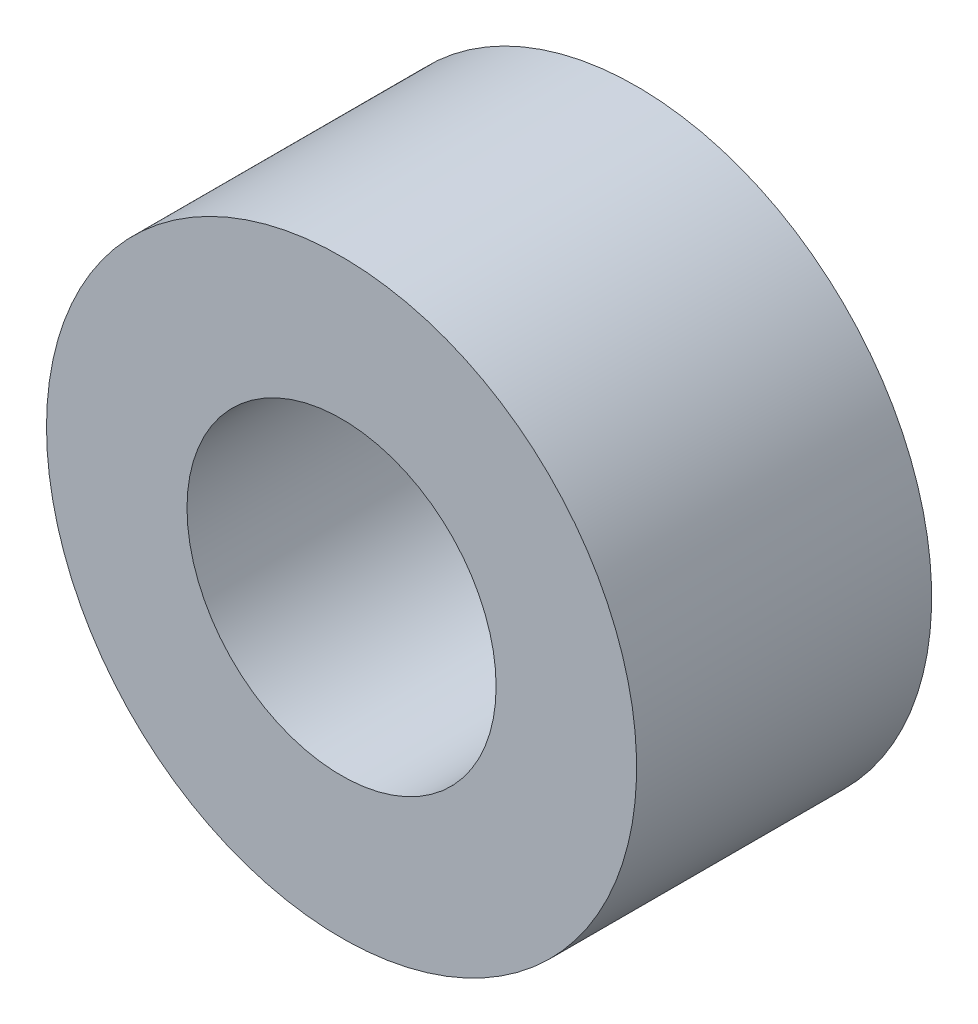
ISO-10303-21;
HEADER;
FILE_DESCRIPTION(('STEP AP214'),'2;1');
FILE_NAME('part.step','',(''),(''),'','','');
FILE_SCHEMA(('AUTOMOTIVE_DESIGN { 1 0 10303 214 1 1 1 1 }'));
ENDSEC;
DATA;
#1=APPLICATION_CONTEXT('core data for automotive mechanical design processes');
#2=APPLICATION_PROTOCOL_DEFINITION('international standard','automotive_design',2000,#1);
#3=PRODUCT_CONTEXT('',#1,'mechanical');
#4=PRODUCT('Part','Part','',(#3));
#5=PRODUCT_RELATED_PRODUCT_CATEGORY('part','',(#4));
#6=PRODUCT_DEFINITION_FORMATION('','',#4);
#7=PRODUCT_DEFINITION_CONTEXT('part definition',#1,'design');
#8=PRODUCT_DEFINITION('design','',#6,#7);
#9=PRODUCT_DEFINITION_SHAPE('','',#8);
#10=(LENGTH_UNIT() NAMED_UNIT(*) SI_UNIT(.MILLI.,.METRE.));
#11=(NAMED_UNIT(*) PLANE_ANGLE_UNIT() SI_UNIT($,.RADIAN.));
#12=(NAMED_UNIT(*) SI_UNIT($,.STERADIAN.) SOLID_ANGLE_UNIT());
#13=UNCERTAINTY_MEASURE_WITH_UNIT(LENGTH_MEASURE(1.E-05),#10,'distance_accuracy_value','');
#14=(GEOMETRIC_REPRESENTATION_CONTEXT(3) GLOBAL_UNCERTAINTY_ASSIGNED_CONTEXT((#13)) GLOBAL_UNIT_ASSIGNED_CONTEXT((#10,
#11,#12)) REPRESENTATION_CONTEXT('',''));
#15=CARTESIAN_POINT('',(0.,0.,0.));
#16=DIRECTION('',(0.,0.,1.));
#17=DIRECTION('',(1.,0.,0.));
#18=AXIS2_PLACEMENT_3D('',#15,#16,#17);
#19=CARTESIAN_POINT('',(0.,0.,10.5));
#20=DIRECTION('',(0.,0.,1.));
#21=DIRECTION('',(1.,0.,0.));
#22=AXIS2_PLACEMENT_3D('',#19,#20,#21);
#23=PLANE('',#22);
#24=CARTESIAN_POINT('',(0.,0.,10.5));
#25=DIRECTION('',(0.,0.,1.));
#26=DIRECTION('',(1.,0.,0.));
#27=AXIS2_PLACEMENT_3D('',#24,#25,#26);
#28=CIRCLE('',#27,10.5);
#29=CARTESIAN_POINT('',(-10.5,0.,10.5));
#30=VERTEX_POINT('',#29);
#31=EDGE_CURVE('E10',#30,#30,#28,.T.);
#32=ORIENTED_EDGE('',*,*,#31,.T.);
#33=EDGE_LOOP('',(#32));
#34=FACE_BOUND('',#33,.T.);
#35=CARTESIAN_POINT('',(0.,0.,10.5));
#36=DIRECTION('',(0.,0.,1.));
#37=DIRECTION('',(1.,0.,0.));
#38=AXIS2_PLACEMENT_3D('',#35,#36,#37);
#39=CIRCLE('',#38,5.5);
#40=CARTESIAN_POINT('',(-5.5,0.,10.5));
#41=VERTEX_POINT('',#40);
#42=EDGE_CURVE('E42',#41,#41,#39,.T.);
#43=ORIENTED_EDGE('',*,*,#42,.F.);
#44=EDGE_LOOP('',(#43));
#45=FACE_BOUND('',#44,.T.);
#46=ADVANCED_FACE('F31',(#34,#45),#23,.T.);
#47=CARTESIAN_POINT('',(0.,0.,0.));
#48=DIRECTION('',(0.,0.,1.));
#49=DIRECTION('',(1.,0.,0.));
#50=AXIS2_PLACEMENT_3D('',#47,#48,#49);
#51=PLANE('',#50);
#52=CARTESIAN_POINT('',(0.,0.,0.));
#53=DIRECTION('',(0.,0.,1.));
#54=DIRECTION('',(1.,0.,0.));
#55=AXIS2_PLACEMENT_3D('',#52,#53,#54);
#56=CIRCLE('',#55,10.5);
#57=CARTESIAN_POINT('',(-10.5,0.,0.));
#58=VERTEX_POINT('',#57);
#59=EDGE_CURVE('E35',#58,#58,#56,.T.);
#60=ORIENTED_EDGE('',*,*,#59,.F.);
#61=EDGE_LOOP('',(#60));
#62=FACE_BOUND('',#61,.T.);
#63=CARTESIAN_POINT('',(0.,0.,0.));
#64=DIRECTION('',(0.,0.,1.));
#65=DIRECTION('',(1.,0.,0.));
#66=AXIS2_PLACEMENT_3D('',#63,#64,#65);
#67=CIRCLE('',#66,5.5);
#68=CARTESIAN_POINT('',(-5.5,0.,0.));
#69=VERTEX_POINT('',#68);
#70=EDGE_CURVE('E44',#69,#69,#67,.T.);
#71=ORIENTED_EDGE('',*,*,#70,.T.);
#72=EDGE_LOOP('',(#71));
#73=FACE_BOUND('',#72,.T.);
#74=ADVANCED_FACE('F54',(#62,#73),#51,.F.);
#75=CARTESIAN_POINT('',(0.,0.,10.5));
#76=DIRECTION('',(0.,0.,-1.));
#77=DIRECTION('',(-1.,0.,0.));
#78=AXIS2_PLACEMENT_3D('',#75,#76,#77);
#79=CYLINDRICAL_SURFACE('',#78,10.5);
#80=CARTESIAN_POINT('',(-10.5,0.,10.5));
#81=CARTESIAN_POINT('',(-10.5,0.,10.390625));
#82=CARTESIAN_POINT('',(-10.5,0.,10.28125));
#83=CARTESIAN_POINT('',(-10.5,0.,10.0625));
#84=CARTESIAN_POINT('',(-10.5,0.,9.953125));
#85=CARTESIAN_POINT('',(-10.5,0.,9.734375));
#86=CARTESIAN_POINT('',(-10.5,0.,9.625));
#87=CARTESIAN_POINT('',(-10.5,0.,9.40625));
#88=CARTESIAN_POINT('',(-10.5,0.,9.296875));
#89=CARTESIAN_POINT('',(-10.5,0.,9.078125));
#90=CARTESIAN_POINT('',(-10.5,0.,8.96875));
#91=CARTESIAN_POINT('',(-10.5,0.,8.75));
#92=CARTESIAN_POINT('',(-10.5,0.,8.640625));
#93=CARTESIAN_POINT('',(-10.5,0.,8.421875));
#94=CARTESIAN_POINT('',(-10.5,0.,8.3125));
#95=CARTESIAN_POINT('',(-10.5,0.,8.09375));
#96=CARTESIAN_POINT('',(-10.5,0.,7.984375));
#97=CARTESIAN_POINT('',(-10.5,0.,7.765625));
#98=CARTESIAN_POINT('',(-10.5,0.,7.65625));
#99=CARTESIAN_POINT('',(-10.5,0.,7.4375));
#100=CARTESIAN_POINT('',(-10.5,0.,7.328125));
#101=CARTESIAN_POINT('',(-10.5,0.,7.109375));
#102=CARTESIAN_POINT('',(-10.5,0.,7.));
#103=CARTESIAN_POINT('',(-10.5,0.,6.78125));
#104=CARTESIAN_POINT('',(-10.5,0.,6.671875));
#105=CARTESIAN_POINT('',(-10.5,0.,6.453125));
#106=CARTESIAN_POINT('',(-10.5,0.,6.34375));
#107=CARTESIAN_POINT('',(-10.5,0.,6.125));
#108=CARTESIAN_POINT('',(-10.5,0.,6.015625));
#109=CARTESIAN_POINT('',(-10.5,0.,5.796875));
#110=CARTESIAN_POINT('',(-10.5,0.,5.6875));
#111=CARTESIAN_POINT('',(-10.5,0.,5.46875));
#112=CARTESIAN_POINT('',(-10.5,0.,5.359375));
#113=CARTESIAN_POINT('',(-10.5,0.,5.140625));
#114=CARTESIAN_POINT('',(-10.5,0.,5.03125));
#115=CARTESIAN_POINT('',(-10.5,0.,4.8125));
#116=CARTESIAN_POINT('',(-10.5,0.,4.703125));
#117=CARTESIAN_POINT('',(-10.5,0.,4.484375));
#118=CARTESIAN_POINT('',(-10.5,0.,4.375));
#119=CARTESIAN_POINT('',(-10.5,0.,4.15625));
#120=CARTESIAN_POINT('',(-10.5,0.,4.046875));
#121=CARTESIAN_POINT('',(-10.5,0.,3.828125));
#122=CARTESIAN_POINT('',(-10.5,0.,3.71875));
#123=CARTESIAN_POINT('',(-10.5,0.,3.5));
#124=CARTESIAN_POINT('',(-10.5,0.,3.390625));
#125=CARTESIAN_POINT('',(-10.5,0.,3.171875));
#126=CARTESIAN_POINT('',(-10.5,0.,3.0625));
#127=CARTESIAN_POINT('',(-10.5,0.,2.84375));
#128=CARTESIAN_POINT('',(-10.5,0.,2.734375));
#129=CARTESIAN_POINT('',(-10.5,0.,2.515625));
#130=CARTESIAN_POINT('',(-10.5,0.,2.40625));
#131=CARTESIAN_POINT('',(-10.5,0.,2.1875));
#132=CARTESIAN_POINT('',(-10.5,0.,2.078125));
#133=CARTESIAN_POINT('',(-10.5,0.,1.859375));
#134=CARTESIAN_POINT('',(-10.5,0.,1.75));
#135=CARTESIAN_POINT('',(-10.5,0.,1.53125));
#136=CARTESIAN_POINT('',(-10.5,0.,1.421875));
#137=CARTESIAN_POINT('',(-10.5,0.,1.203125));
#138=CARTESIAN_POINT('',(-10.5,0.,1.09375));
#139=CARTESIAN_POINT('',(-10.5,0.,0.875000000000001));
#140=CARTESIAN_POINT('',(-10.5,0.,0.765625000000001));
#141=CARTESIAN_POINT('',(-10.5,0.,0.546875));
#142=CARTESIAN_POINT('',(-10.5,0.,0.4375));
#143=CARTESIAN_POINT('',(-10.5,0.,0.21875));
#144=CARTESIAN_POINT('',(-10.5,0.,0.109375));
#145=CARTESIAN_POINT('',(-10.5,0.,0.));
#146=B_SPLINE_CURVE_WITH_KNOTS('',3,(#80,#81,#82,#83,#84,#85,#86,#87,#88,#89,#90,#91,#92,#93,
#94,#95,#96,#97,#98,#99,#100,#101,#102,#103,#104,#105,#106,#107,#108,#109,#110,#111,#112,#113,
#114,#115,#116,#117,#118,#119,#120,#121,#122,#123,#124,#125,#126,#127,#128,#129,#130,#131,#132,
#133,#134,#135,#136,#137,#138,#139,#140,#141,#142,#143,#144,#145),.UNSPECIFIED.,.F.,.F.,(4,2,2,
2,2,2,2,2,2,2,2,2,2,2,2,2,2,2,2,2,2,2,2,2,2,2,2,2,2,2,2,2,4),(0.,0.328125,0.656250000000001,
0.984375000000001,1.3125,1.640625,1.96875,2.296875,2.625,2.953125,3.28125,3.609375,3.9375,
4.265625,4.59375,4.921875,5.25,5.578125,5.90625,6.234375,6.5625,6.890625,7.21875,7.546875,7.875,
8.203125,8.53125,8.859375,9.1875,9.515625,9.84375,10.171875,10.5),.UNSPECIFIED.);
#147=EDGE_CURVE('BSEAM33',#30,#58,#146,.T.);
#148=ORIENTED_EDGE('',*,*,#31,.F.);
#149=ORIENTED_EDGE('',*,*,#59,.T.);
#150=ORIENTED_EDGE('',*,*,#147,.T.);
#151=ORIENTED_EDGE('',*,*,#147,.F.);
#152=EDGE_LOOP('',(#148,#150,#149,#151));
#153=FACE_BOUND('',#152,.T.);
#154=ADVANCED_FACE('F33',(#153),#79,.T.);
#155=CARTESIAN_POINT('',(0.,0.,10.5));
#156=DIRECTION('',(0.,0.,-1.));
#157=DIRECTION('',(-1.,0.,0.));
#158=AXIS2_PLACEMENT_3D('',#155,#156,#157);
#159=CYLINDRICAL_SURFACE('',#158,5.5);
#160=CARTESIAN_POINT('',(-5.5,0.,10.5));
#161=CARTESIAN_POINT('',(-5.5,0.,10.390625));
#162=CARTESIAN_POINT('',(-5.5,0.,10.28125));
#163=CARTESIAN_POINT('',(-5.5,0.,10.0625));
#164=CARTESIAN_POINT('',(-5.5,0.,9.953125));
#165=CARTESIAN_POINT('',(-5.5,0.,9.734375));
#166=CARTESIAN_POINT('',(-5.5,0.,9.625));
#167=CARTESIAN_POINT('',(-5.5,0.,9.40625));
#168=CARTESIAN_POINT('',(-5.5,0.,9.296875));
#169=CARTESIAN_POINT('',(-5.5,0.,9.078125));
#170=CARTESIAN_POINT('',(-5.5,0.,8.96875));
#171=CARTESIAN_POINT('',(-5.5,0.,8.75));
#172=CARTESIAN_POINT('',(-5.5,0.,8.640625));
#173=CARTESIAN_POINT('',(-5.5,0.,8.421875));
#174=CARTESIAN_POINT('',(-5.5,0.,8.3125));
#175=CARTESIAN_POINT('',(-5.5,0.,8.09375));
#176=CARTESIAN_POINT('',(-5.5,0.,7.984375));
#177=CARTESIAN_POINT('',(-5.5,0.,7.765625));
#178=CARTESIAN_POINT('',(-5.5,0.,7.65625));
#179=CARTESIAN_POINT('',(-5.5,0.,7.4375));
#180=CARTESIAN_POINT('',(-5.5,0.,7.328125));
#181=CARTESIAN_POINT('',(-5.5,0.,7.109375));
#182=CARTESIAN_POINT('',(-5.5,0.,7.));
#183=CARTESIAN_POINT('',(-5.5,0.,6.78125));
#184=CARTESIAN_POINT('',(-5.5,0.,6.671875));
#185=CARTESIAN_POINT('',(-5.5,0.,6.453125));
#186=CARTESIAN_POINT('',(-5.5,0.,6.34375));
#187=CARTESIAN_POINT('',(-5.5,0.,6.125));
#188=CARTESIAN_POINT('',(-5.5,0.,6.015625));
#189=CARTESIAN_POINT('',(-5.5,0.,5.796875));
#190=CARTESIAN_POINT('',(-5.5,0.,5.6875));
#191=CARTESIAN_POINT('',(-5.5,0.,5.46875));
#192=CARTESIAN_POINT('',(-5.5,0.,5.359375));
#193=CARTESIAN_POINT('',(-5.5,0.,5.140625));
#194=CARTESIAN_POINT('',(-5.5,0.,5.03125));
#195=CARTESIAN_POINT('',(-5.5,0.,4.8125));
#196=CARTESIAN_POINT('',(-5.5,0.,4.703125));
#197=CARTESIAN_POINT('',(-5.5,0.,4.484375));
#198=CARTESIAN_POINT('',(-5.5,0.,4.375));
#199=CARTESIAN_POINT('',(-5.5,0.,4.15625));
#200=CARTESIAN_POINT('',(-5.5,0.,4.046875));
#201=CARTESIAN_POINT('',(-5.5,0.,3.828125));
#202=CARTESIAN_POINT('',(-5.5,0.,3.71875));
#203=CARTESIAN_POINT('',(-5.5,0.,3.5));
#204=CARTESIAN_POINT('',(-5.5,0.,3.390625));
#205=CARTESIAN_POINT('',(-5.5,0.,3.171875));
#206=CARTESIAN_POINT('',(-5.5,0.,3.0625));
#207=CARTESIAN_POINT('',(-5.5,0.,2.84375));
#208=CARTESIAN_POINT('',(-5.5,0.,2.734375));
#209=CARTESIAN_POINT('',(-5.5,0.,2.515625));
#210=CARTESIAN_POINT('',(-5.5,0.,2.40625));
#211=CARTESIAN_POINT('',(-5.5,0.,2.1875));
#212=CARTESIAN_POINT('',(-5.5,0.,2.078125));
#213=CARTESIAN_POINT('',(-5.5,0.,1.859375));
#214=CARTESIAN_POINT('',(-5.5,0.,1.75));
#215=CARTESIAN_POINT('',(-5.5,0.,1.53125));
#216=CARTESIAN_POINT('',(-5.5,0.,1.421875));
#217=CARTESIAN_POINT('',(-5.5,0.,1.203125));
#218=CARTESIAN_POINT('',(-5.5,0.,1.09375));
#219=CARTESIAN_POINT('',(-5.5,0.,0.875000000000001));
#220=CARTESIAN_POINT('',(-5.5,0.,0.765625000000001));
#221=CARTESIAN_POINT('',(-5.5,0.,0.546875));
#222=CARTESIAN_POINT('',(-5.5,0.,0.4375));
#223=CARTESIAN_POINT('',(-5.5,0.,0.21875));
#224=CARTESIAN_POINT('',(-5.5,0.,0.109375));
#225=CARTESIAN_POINT('',(-5.5,0.,0.));
#226=B_SPLINE_CURVE_WITH_KNOTS('',3,(#160,#161,#162,#163,#164,#165,#166,#167,#168,#169,#170,
#171,#172,#173,#174,#175,#176,#177,#178,#179,#180,#181,#182,#183,#184,#185,#186,#187,#188,#189,
#190,#191,#192,#193,#194,#195,#196,#197,#198,#199,#200,#201,#202,#203,#204,#205,#206,#207,#208,
#209,#210,#211,#212,#213,#214,#215,#216,#217,#218,#219,#220,#221,#222,#223,#224,#225),
.UNSPECIFIED.,.F.,.F.,(4,2,2,2,2,2,2,2,2,2,2,2,2,2,2,2,2,2,2,2,2,2,2,2,2,2,2,2,2,2,2,2,4),(0.,
0.328124999999999,0.656249999999999,0.984374999999999,1.3125,1.640625,1.96875,2.296875,2.625,
2.953125,3.28125,3.609375,3.9375,4.265625,4.59375,4.921875,5.25,5.578125,5.90625,6.234375,
6.5625,6.890625,7.21875,7.546875,7.875,8.203125,8.53125,8.859375,9.1875,9.515625,9.84375,
10.171875,10.5),.UNSPECIFIED.);
#227=EDGE_CURVE('BSEAM50',#41,#69,#226,.T.);
#228=ORIENTED_EDGE('',*,*,#42,.T.);
#229=ORIENTED_EDGE('',*,*,#70,.F.);
#230=ORIENTED_EDGE('',*,*,#227,.T.);
#231=ORIENTED_EDGE('',*,*,#227,.F.);
#232=EDGE_LOOP('',(#228,#230,#229,#231));
#233=FACE_BOUND('',#232,.T.);
#234=ADVANCED_FACE('F50',(#233),#159,.F.);
#235=CLOSED_SHELL('',(#46,#74,#154,#234));
#236=MANIFOLD_SOLID_BREP('B2',#235);
#237=ADVANCED_BREP_SHAPE_REPRESENTATION('',(#18,#236),#14);
#238=SHAPE_DEFINITION_REPRESENTATION(#9,#237);
ENDSEC;
END-ISO-10303-21;
